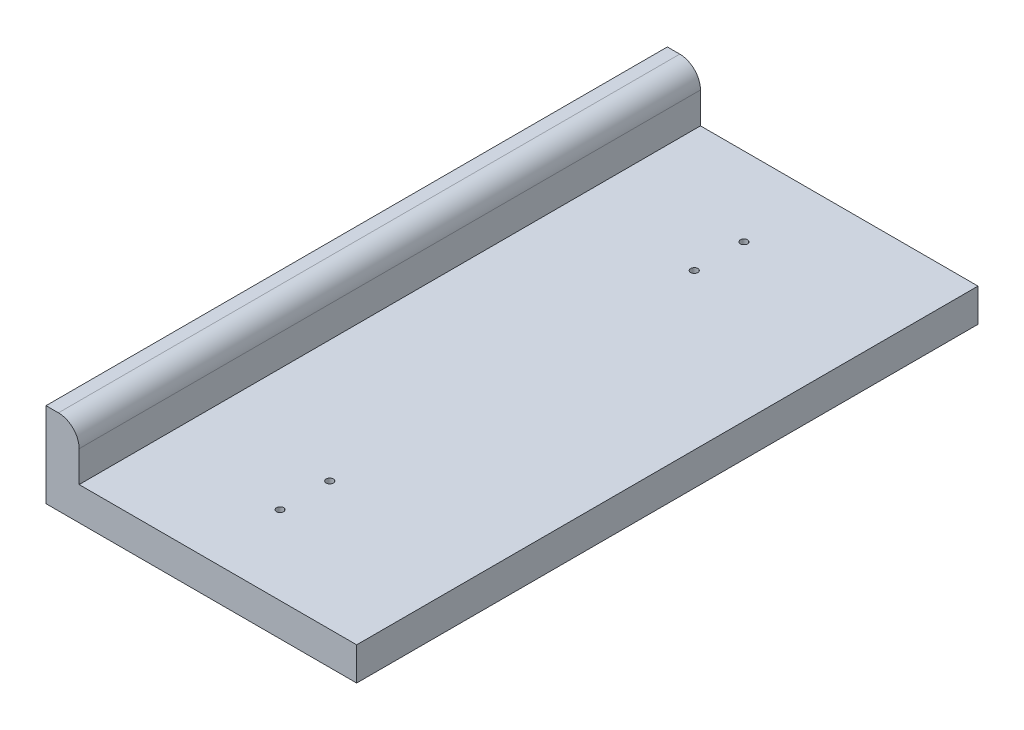
ISO-10303-21;
HEADER;
FILE_DESCRIPTION(('STEP AP214'),'2;1');
FILE_NAME('part.step','',(''),(''),'','','');
FILE_SCHEMA(('AUTOMOTIVE_DESIGN { 1 0 10303 214 1 1 1 1 }'));
ENDSEC;
DATA;
#1=APPLICATION_CONTEXT('core data for automotive mechanical design processes');
#2=APPLICATION_PROTOCOL_DEFINITION('international standard','automotive_design',2000,#1);
#3=PRODUCT_CONTEXT('',#1,'mechanical');
#4=PRODUCT('Part','Part','',(#3));
#5=PRODUCT_RELATED_PRODUCT_CATEGORY('part','',(#4));
#6=PRODUCT_DEFINITION_FORMATION('','',#4);
#7=PRODUCT_DEFINITION_CONTEXT('part definition',#1,'design');
#8=PRODUCT_DEFINITION('design','',#6,#7);
#9=PRODUCT_DEFINITION_SHAPE('','',#8);
#10=(LENGTH_UNIT() NAMED_UNIT(*) SI_UNIT(.MILLI.,.METRE.));
#11=(NAMED_UNIT(*) PLANE_ANGLE_UNIT() SI_UNIT($,.RADIAN.));
#12=(NAMED_UNIT(*) SI_UNIT($,.STERADIAN.) SOLID_ANGLE_UNIT());
#13=UNCERTAINTY_MEASURE_WITH_UNIT(LENGTH_MEASURE(1.E-05),#10,'distance_accuracy_value','');
#14=(GEOMETRIC_REPRESENTATION_CONTEXT(3) GLOBAL_UNCERTAINTY_ASSIGNED_CONTEXT((#13)) GLOBAL_UNIT_ASSIGNED_CONTEXT((#10,
#11,#12)) REPRESENTATION_CONTEXT('',''));
#15=CARTESIAN_POINT('',(0.,0.,0.));
#16=DIRECTION('',(0.,0.,1.));
#17=DIRECTION('',(1.,0.,0.));
#18=AXIS2_PLACEMENT_3D('',#15,#16,#17);
#19=CARTESIAN_POINT('',(0.,16.,0.));
#20=DIRECTION('',(0.,-1.,0.));
#21=DIRECTION('',(0.,0.,-1.));
#22=AXIS2_PLACEMENT_3D('',#19,#20,#21);
#23=PLANE('',#22);
#24=CARTESIAN_POINT('',(0.,16.,112.));
#25=DIRECTION('',(0.,-1.,0.));
#26=DIRECTION('',(0.,0.,-1.));
#27=AXIS2_PLACEMENT_3D('',#24,#25,#26);
#28=CIRCLE('',#27,1.7272);
#29=CARTESIAN_POINT('',(0.,16.,110.2728));
#30=VERTEX_POINT('',#29);
#31=EDGE_CURVE('E339',#30,#30,#28,.T.);
#32=ORIENTED_EDGE('',*,*,#31,.T.);
#33=EDGE_LOOP('',(#32));
#34=FACE_BOUND('',#33,.T.);
#35=CARTESIAN_POINT('',(0.,16.,88.0000000000001));
#36=DIRECTION('',(0.,-1.,0.));
#37=DIRECTION('',(0.,0.,-1.));
#38=AXIS2_PLACEMENT_3D('',#35,#36,#37);
#39=CIRCLE('',#38,1.7272);
#40=CARTESIAN_POINT('',(0.,16.,86.2728));
#41=VERTEX_POINT('',#40);
#42=EDGE_CURVE('E343',#41,#41,#39,.T.);
#43=ORIENTED_EDGE('',*,*,#42,.T.);
#44=EDGE_LOOP('',(#43));
#45=FACE_BOUND('',#44,.T.);
#46=CARTESIAN_POINT('',(0.,16.,-112.));
#47=DIRECTION('',(0.,-1.,0.));
#48=DIRECTION('',(0.,0.,-1.));
#49=AXIS2_PLACEMENT_3D('',#46,#47,#48);
#50=CIRCLE('',#49,1.7272);
#51=CARTESIAN_POINT('',(0.,16.,-113.7272));
#52=VERTEX_POINT('',#51);
#53=EDGE_CURVE('E49',#52,#52,#50,.T.);
#54=ORIENTED_EDGE('',*,*,#53,.T.);
#55=EDGE_LOOP('',(#54));
#56=FACE_BOUND('',#55,.T.);
#57=CARTESIAN_POINT('',(0.,16.,-88.0000000000001));
#58=DIRECTION('',(0.,-1.,0.));
#59=DIRECTION('',(0.,0.,-1.));
#60=AXIS2_PLACEMENT_3D('',#57,#58,#59);
#61=CIRCLE('',#60,1.7272);
#62=CARTESIAN_POINT('',(0.,16.,-89.7272000000001));
#63=VERTEX_POINT('',#62);
#64=EDGE_CURVE('E130',#63,#63,#61,.T.);
#65=ORIENTED_EDGE('',*,*,#64,.T.);
#66=EDGE_LOOP('',(#65));
#67=FACE_BOUND('',#66,.T.);
#68=DIRECTION('',(0.,0.,-1.));
#69=VECTOR('',#68,1.);
#70=CARTESIAN_POINT('',(-59.,16.,-150.));
#71=LINE('',#70,#69);
#72=CARTESIAN_POINT('',(-59.,16.,150.));
#73=VERTEX_POINT('',#72);
#74=CARTESIAN_POINT('',(-59.,16.,-150.));
#75=VERTEX_POINT('',#74);
#76=EDGE_CURVE('E127',#73,#75,#71,.T.);
#77=ORIENTED_EDGE('',*,*,#76,.F.);
#78=DIRECTION('',(1.,0.,0.));
#79=VECTOR('',#78,1.);
#80=CARTESIAN_POINT('',(-75.,16.,150.));
#81=LINE('',#80,#79);
#82=CARTESIAN_POINT('',(75.,16.,150.));
#83=VERTEX_POINT('',#82);
#84=EDGE_CURVE('E148',#73,#83,#81,.T.);
#85=ORIENTED_EDGE('',*,*,#84,.T.);
#86=DIRECTION('',(0.,0.,-1.));
#87=VECTOR('',#86,1.);
#88=CARTESIAN_POINT('',(75.,16.,150.));
#89=LINE('',#88,#87);
#90=CARTESIAN_POINT('',(75.,16.,-150.));
#91=VERTEX_POINT('',#90);
#92=EDGE_CURVE('E141',#83,#91,#89,.T.);
#93=ORIENTED_EDGE('',*,*,#92,.T.);
#94=DIRECTION('',(-1.,0.,0.));
#95=VECTOR('',#94,1.);
#96=CARTESIAN_POINT('',(-75.,16.,-150.));
#97=LINE('',#96,#95);
#98=EDGE_CURVE('E144',#91,#75,#97,.T.);
#99=ORIENTED_EDGE('',*,*,#98,.T.);
#100=EDGE_LOOP('',(#77,#85,#93,#99));
#101=FACE_BOUND('',#100,.T.);
#102=ADVANCED_FACE('F45',(#34,#45,#56,#67,#101),#23,.F.);
#103=CARTESIAN_POINT('',(75.,16.,150.));
#104=DIRECTION('',(-1.,0.,0.));
#105=DIRECTION('',(0.,0.,1.));
#106=AXIS2_PLACEMENT_3D('',#103,#104,#105);
#107=PLANE('',#106);
#108=DIRECTION('',(0.,0.,-1.));
#109=VECTOR('',#108,1.);
#110=CARTESIAN_POINT('',(75.,0.,150.));
#111=LINE('',#110,#109);
#112=CARTESIAN_POINT('',(75.,0.,150.));
#113=VERTEX_POINT('',#112);
#114=CARTESIAN_POINT('',(75.,0.,-150.));
#115=VERTEX_POINT('',#114);
#116=EDGE_CURVE('E140',#113,#115,#111,.T.);
#117=ORIENTED_EDGE('',*,*,#116,.T.);
#118=DIRECTION('',(0.,-1.,0.));
#119=VECTOR('',#118,1.);
#120=CARTESIAN_POINT('',(75.,16.,-150.));
#121=LINE('',#120,#119);
#122=EDGE_CURVE('E159',#91,#115,#121,.T.);
#123=ORIENTED_EDGE('',*,*,#122,.F.);
#124=ORIENTED_EDGE('',*,*,#92,.F.);
#125=DIRECTION('',(0.,-1.,0.));
#126=VECTOR('',#125,1.);
#127=CARTESIAN_POINT('',(75.,16.,150.));
#128=LINE('',#127,#126);
#129=EDGE_CURVE('E114',#83,#113,#128,.T.);
#130=ORIENTED_EDGE('',*,*,#129,.T.);
#131=EDGE_LOOP('',(#117,#123,#124,#130));
#132=FACE_BOUND('',#131,.T.);
#133=ADVANCED_FACE('F174',(#132),#107,.F.);
#134=CARTESIAN_POINT('',(-75.,16.,-150.));
#135=DIRECTION('',(0.,0.,1.));
#136=DIRECTION('',(1.,0.,0.));
#137=AXIS2_PLACEMENT_3D('',#134,#135,#136);
#138=PLANE('',#137);
#139=DIRECTION('',(-1.,0.,0.));
#140=VECTOR('',#139,1.);
#141=CARTESIAN_POINT('',(-75.,41.,-150.));
#142=LINE('',#141,#140);
#143=CARTESIAN_POINT('',(-69.,41.,-150.));
#144=VERTEX_POINT('',#143);
#145=CARTESIAN_POINT('',(-75.,41.,-150.));
#146=VERTEX_POINT('',#145);
#147=EDGE_CURVE('E123',#144,#146,#142,.T.);
#148=ORIENTED_EDGE('',*,*,#147,.F.);
#149=CARTESIAN_POINT('',(-69.,31.,-150.));
#150=DIRECTION('',(0.,0.,1.));
#151=DIRECTION('',(1.,0.,0.));
#152=AXIS2_PLACEMENT_3D('',#149,#150,#151);
#153=CIRCLE('',#152,10.);
#154=CARTESIAN_POINT('',(-59.,31.,-150.));
#155=VERTEX_POINT('',#154);
#156=EDGE_CURVE('E68',#144,#155,#153,.F.);
#157=ORIENTED_EDGE('',*,*,#156,.T.);
#158=DIRECTION('',(0.,-1.,0.));
#159=VECTOR('',#158,1.);
#160=CARTESIAN_POINT('',(-59.,41.,-150.));
#161=LINE('',#160,#159);
#162=EDGE_CURVE('E135',#155,#75,#161,.T.);
#163=ORIENTED_EDGE('',*,*,#162,.T.);
#164=ORIENTED_EDGE('',*,*,#98,.F.);
#165=ORIENTED_EDGE('',*,*,#122,.T.);
#166=DIRECTION('',(-1.,0.,0.));
#167=VECTOR('',#166,1.);
#168=CARTESIAN_POINT('',(-75.,0.,-150.));
#169=LINE('',#168,#167);
#170=CARTESIAN_POINT('',(-75.,0.,-150.));
#171=VERTEX_POINT('',#170);
#172=EDGE_CURVE('E152',#115,#171,#169,.T.);
#173=ORIENTED_EDGE('',*,*,#172,.T.);
#174=DIRECTION('',(0.,-1.,0.));
#175=VECTOR('',#174,1.);
#176=CARTESIAN_POINT('',(-75.,16.,-150.));
#177=LINE('',#176,#175);
#178=EDGE_CURVE('E113',#146,#171,#177,.T.);
#179=ORIENTED_EDGE('',*,*,#178,.F.);
#180=EDGE_LOOP('',(#148,#157,#163,#164,#165,#173,#179));
#181=FACE_BOUND('',#180,.T.);
#182=ADVANCED_FACE('F166',(#181),#138,.F.);
#183=CARTESIAN_POINT('',(-75.,16.,150.));
#184=DIRECTION('',(1.,0.,0.));
#185=DIRECTION('',(0.,0.,-1.));
#186=AXIS2_PLACEMENT_3D('',#183,#184,#185);
#187=PLANE('',#186);
#188=DIRECTION('',(0.,0.,1.));
#189=VECTOR('',#188,1.);
#190=CARTESIAN_POINT('',(-75.,0.,150.));
#191=LINE('',#190,#189);
#192=CARTESIAN_POINT('',(-75.,0.,150.));
#193=VERTEX_POINT('',#192);
#194=EDGE_CURVE('E110',#171,#193,#191,.T.);
#195=ORIENTED_EDGE('',*,*,#194,.T.);
#196=DIRECTION('',(0.,-1.,0.));
#197=VECTOR('',#196,1.);
#198=CARTESIAN_POINT('',(-75.,16.,150.));
#199=LINE('',#198,#197);
#200=CARTESIAN_POINT('',(-74.9999999999999,41.,150.));
#201=VERTEX_POINT('',#200);
#202=EDGE_CURVE('E103',#201,#193,#199,.T.);
#203=ORIENTED_EDGE('',*,*,#202,.F.);
#204=DIRECTION('',(0.,0.,1.));
#205=VECTOR('',#204,1.);
#206=CARTESIAN_POINT('',(-75.,41.,-150.));
#207=LINE('',#206,#205);
#208=EDGE_CURVE('E108',#146,#201,#207,.T.);
#209=ORIENTED_EDGE('',*,*,#208,.F.);
#210=ORIENTED_EDGE('',*,*,#178,.T.);
#211=EDGE_LOOP('',(#195,#203,#209,#210));
#212=FACE_BOUND('',#211,.T.);
#213=ADVANCED_FACE('F105',(#212),#187,.F.);
#214=CARTESIAN_POINT('',(-75.,16.,150.));
#215=DIRECTION('',(0.,0.,-1.));
#216=DIRECTION('',(-1.,0.,0.));
#217=AXIS2_PLACEMENT_3D('',#214,#215,#216);
#218=PLANE('',#217);
#219=DIRECTION('',(0.,-1.,0.));
#220=VECTOR('',#219,1.);
#221=CARTESIAN_POINT('',(-58.9999999999999,41.,150.));
#222=LINE('',#221,#220);
#223=CARTESIAN_POINT('',(-58.9999999999999,31.,150.));
#224=VERTEX_POINT('',#223);
#225=EDGE_CURVE('E138',#224,#73,#222,.T.);
#226=ORIENTED_EDGE('',*,*,#225,.F.);
#227=CARTESIAN_POINT('',(-68.9999999999999,31.,150.));
#228=DIRECTION('',(0.,0.,-1.));
#229=DIRECTION('',(-1.,0.,0.));
#230=AXIS2_PLACEMENT_3D('',#227,#228,#229);
#231=CIRCLE('',#230,10.);
#232=CARTESIAN_POINT('',(-68.9999999999999,41.,150.));
#233=VERTEX_POINT('',#232);
#234=EDGE_CURVE('E11',#224,#233,#231,.F.);
#235=ORIENTED_EDGE('',*,*,#234,.T.);
#236=DIRECTION('',(1.,0.,0.));
#237=VECTOR('',#236,1.);
#238=CARTESIAN_POINT('',(-74.9999999999999,41.,150.));
#239=LINE('',#238,#237);
#240=EDGE_CURVE('E117',#201,#233,#239,.T.);
#241=ORIENTED_EDGE('',*,*,#240,.F.);
#242=ORIENTED_EDGE('',*,*,#202,.T.);
#243=DIRECTION('',(1.,0.,0.));
#244=VECTOR('',#243,1.);
#245=CARTESIAN_POINT('',(-75.,0.,150.));
#246=LINE('',#245,#244);
#247=EDGE_CURVE('E145',#193,#113,#246,.T.);
#248=ORIENTED_EDGE('',*,*,#247,.T.);
#249=ORIENTED_EDGE('',*,*,#129,.F.);
#250=ORIENTED_EDGE('',*,*,#84,.F.);
#251=EDGE_LOOP('',(#226,#235,#241,#242,#248,#249,#250));
#252=FACE_BOUND('',#251,.T.);
#253=ADVANCED_FACE('F118',(#252),#218,.F.);
#254=CARTESIAN_POINT('',(0.,0.,0.));
#255=DIRECTION('',(0.,-1.,0.));
#256=DIRECTION('',(0.,0.,-1.));
#257=AXIS2_PLACEMENT_3D('',#254,#255,#256);
#258=PLANE('',#257);
#259=CARTESIAN_POINT('',(0.,0.,112.));
#260=DIRECTION('',(0.,-1.,0.));
#261=DIRECTION('',(0.,0.,-1.));
#262=AXIS2_PLACEMENT_3D('',#259,#260,#261);
#263=CIRCLE('',#262,1.7272);
#264=CARTESIAN_POINT('',(0.,0.,110.2728));
#265=VERTEX_POINT('',#264);
#266=EDGE_CURVE('E337',#265,#265,#263,.T.);
#267=ORIENTED_EDGE('',*,*,#266,.F.);
#268=EDGE_LOOP('',(#267));
#269=FACE_BOUND('',#268,.T.);
#270=CARTESIAN_POINT('',(0.,0.,88.0000000000001));
#271=DIRECTION('',(0.,-1.,0.));
#272=DIRECTION('',(0.,0.,-1.));
#273=AXIS2_PLACEMENT_3D('',#270,#271,#272);
#274=CIRCLE('',#273,1.7272);
#275=CARTESIAN_POINT('',(0.,0.,86.2728));
#276=VERTEX_POINT('',#275);
#277=EDGE_CURVE('E340',#276,#276,#274,.T.);
#278=ORIENTED_EDGE('',*,*,#277,.F.);
#279=EDGE_LOOP('',(#278));
#280=FACE_BOUND('',#279,.T.);
#281=CARTESIAN_POINT('',(0.,0.,-112.));
#282=DIRECTION('',(0.,-1.,0.));
#283=DIRECTION('',(0.,0.,-1.));
#284=AXIS2_PLACEMENT_3D('',#281,#282,#283);
#285=CIRCLE('',#284,1.7272);
#286=CARTESIAN_POINT('',(0.,0.,-113.7272));
#287=VERTEX_POINT('',#286);
#288=EDGE_CURVE('E349',#287,#287,#285,.T.);
#289=ORIENTED_EDGE('',*,*,#288,.F.);
#290=EDGE_LOOP('',(#289));
#291=FACE_BOUND('',#290,.T.);
#292=CARTESIAN_POINT('',(0.,0.,-88.0000000000001));
#293=DIRECTION('',(0.,-1.,0.));
#294=DIRECTION('',(0.,0.,-1.));
#295=AXIS2_PLACEMENT_3D('',#292,#293,#294);
#296=CIRCLE('',#295,1.7272);
#297=CARTESIAN_POINT('',(0.,0.,-89.7272000000001));
#298=VERTEX_POINT('',#297);
#299=EDGE_CURVE('E351',#298,#298,#296,.T.);
#300=ORIENTED_EDGE('',*,*,#299,.F.);
#301=EDGE_LOOP('',(#300));
#302=FACE_BOUND('',#301,.T.);
#303=ORIENTED_EDGE('',*,*,#116,.F.);
#304=ORIENTED_EDGE('',*,*,#247,.F.);
#305=ORIENTED_EDGE('',*,*,#194,.F.);
#306=ORIENTED_EDGE('',*,*,#172,.F.);
#307=EDGE_LOOP('',(#303,#304,#305,#306));
#308=FACE_BOUND('',#307,.T.);
#309=ADVANCED_FACE('F169',(#269,#280,#291,#302,#308),#258,.T.);
#310=CARTESIAN_POINT('',(-59.,41.,-150.));
#311=DIRECTION('',(-1.,0.,0.));
#312=DIRECTION('',(0.,0.,1.));
#313=AXIS2_PLACEMENT_3D('',#310,#311,#312);
#314=PLANE('',#313);
#315=ORIENTED_EDGE('',*,*,#162,.F.);
#316=DIRECTION('',(0.,0.,-1.));
#317=VECTOR('',#316,1.);
#318=CARTESIAN_POINT('',(-58.9999999999999,31.,150.));
#319=LINE('',#318,#317);
#320=EDGE_CURVE('E54',#155,#224,#319,.F.);
#321=ORIENTED_EDGE('',*,*,#320,.T.);
#322=ORIENTED_EDGE('',*,*,#225,.T.);
#323=ORIENTED_EDGE('',*,*,#76,.T.);
#324=EDGE_LOOP('',(#315,#321,#322,#323));
#325=FACE_BOUND('',#324,.T.);
#326=ADVANCED_FACE('F188',(#325),#314,.F.);
#327=CARTESIAN_POINT('',(0.,41.,0.));
#328=DIRECTION('',(0.,1.,0.));
#329=DIRECTION('',(0.,0.,1.));
#330=AXIS2_PLACEMENT_3D('',#327,#328,#329);
#331=PLANE('',#330);
#332=ORIENTED_EDGE('',*,*,#240,.T.);
#333=DIRECTION('',(0.,0.,-1.));
#334=VECTOR('',#333,1.);
#335=CARTESIAN_POINT('',(-69.,41.,-150.));
#336=LINE('',#335,#334);
#337=EDGE_CURVE('E162',#233,#144,#336,.T.);
#338=ORIENTED_EDGE('',*,*,#337,.T.);
#339=ORIENTED_EDGE('',*,*,#147,.T.);
#340=ORIENTED_EDGE('',*,*,#208,.T.);
#341=EDGE_LOOP('',(#332,#338,#339,#340));
#342=FACE_BOUND('',#341,.T.);
#343=ADVANCED_FACE('F125',(#342),#331,.T.);
#344=CARTESIAN_POINT('',(-68.9999999999999,31.,0.));
#345=DIRECTION('',(0.,0.,1.));
#346=DIRECTION('',(1.,0.,0.));
#347=AXIS2_PLACEMENT_3D('',#344,#345,#346);
#348=CYLINDRICAL_SURFACE('',#347,10.);
#349=ORIENTED_EDGE('',*,*,#234,.F.);
#350=ORIENTED_EDGE('',*,*,#320,.F.);
#351=ORIENTED_EDGE('',*,*,#156,.F.);
#352=ORIENTED_EDGE('',*,*,#337,.F.);
#353=EDGE_LOOP('',(#349,#350,#351,#352));
#354=FACE_BOUND('',#353,.T.);
#355=ADVANCED_FACE('F47',(#354),#348,.T.);
#356=CARTESIAN_POINT('',(0.,0.,-88.0000000000001));
#357=DIRECTION('',(0.,-1.,0.));
#358=DIRECTION('',(0.,0.,-1.));
#359=AXIS2_PLACEMENT_3D('',#356,#357,#358);
#360=CYLINDRICAL_SURFACE('',#359,1.7272);
#361=ORIENTED_EDGE('',*,*,#299,.T.);
#362=EDGE_LOOP('',(#361));
#363=FACE_BOUND('',#362,.T.);
#364=ORIENTED_EDGE('',*,*,#64,.F.);
#365=EDGE_LOOP('',(#364));
#366=FACE_BOUND('',#365,.T.);
#367=ADVANCED_FACE('F179',(#363,#366),#360,.F.);
#368=CARTESIAN_POINT('',(0.,0.,-112.));
#369=DIRECTION('',(0.,-1.,0.));
#370=DIRECTION('',(0.,0.,-1.));
#371=AXIS2_PLACEMENT_3D('',#368,#369,#370);
#372=CYLINDRICAL_SURFACE('',#371,1.7272);
#373=ORIENTED_EDGE('',*,*,#288,.T.);
#374=EDGE_LOOP('',(#373));
#375=FACE_BOUND('',#374,.T.);
#376=ORIENTED_EDGE('',*,*,#53,.F.);
#377=EDGE_LOOP('',(#376));
#378=FACE_BOUND('',#377,.T.);
#379=ADVANCED_FACE('F185',(#375,#378),#372,.F.);
#380=CARTESIAN_POINT('',(0.,0.,88.0000000000001));
#381=DIRECTION('',(0.,-1.,0.));
#382=DIRECTION('',(0.,0.,-1.));
#383=AXIS2_PLACEMENT_3D('',#380,#381,#382);
#384=CYLINDRICAL_SURFACE('',#383,1.7272);
#385=ORIENTED_EDGE('',*,*,#277,.T.);
#386=EDGE_LOOP('',(#385));
#387=FACE_BOUND('',#386,.T.);
#388=ORIENTED_EDGE('',*,*,#42,.F.);
#389=EDGE_LOOP('',(#388));
#390=FACE_BOUND('',#389,.T.);
#391=ADVANCED_FACE('F252',(#387,#390),#384,.F.);
#392=CARTESIAN_POINT('',(0.,0.,112.));
#393=DIRECTION('',(0.,-1.,0.));
#394=DIRECTION('',(0.,0.,-1.));
#395=AXIS2_PLACEMENT_3D('',#392,#393,#394);
#396=CYLINDRICAL_SURFACE('',#395,1.7272);
#397=ORIENTED_EDGE('',*,*,#266,.T.);
#398=EDGE_LOOP('',(#397));
#399=FACE_BOUND('',#398,.T.);
#400=ORIENTED_EDGE('',*,*,#31,.F.);
#401=EDGE_LOOP('',(#400));
#402=FACE_BOUND('',#401,.T.);
#403=ADVANCED_FACE('F264',(#399,#402),#396,.F.);
#404=CLOSED_SHELL('',(#102,#133,#182,#213,#253,#309,#326,#343,#355,#367,#379,#391,#403));
#405=MANIFOLD_SOLID_BREP('B2',#404);
#406=ADVANCED_BREP_SHAPE_REPRESENTATION('',(#18,#405),#14);
#407=SHAPE_DEFINITION_REPRESENTATION(#9,#406);
ENDSEC;
END-ISO-10303-21;
